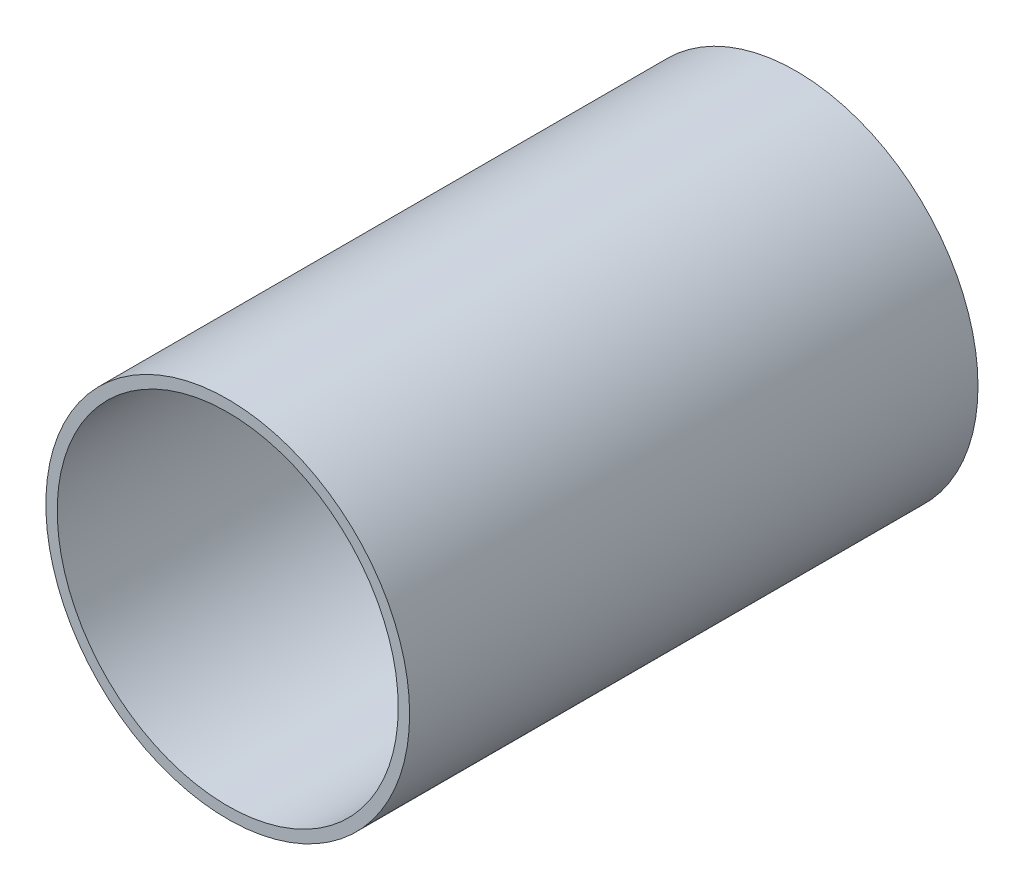
ISO-10303-21;
HEADER;
FILE_DESCRIPTION(('STEP AP214'),'2;1');
FILE_NAME('part.step','',(''),(''),'','','');
FILE_SCHEMA(('AUTOMOTIVE_DESIGN { 1 0 10303 214 1 1 1 1 }'));
ENDSEC;
DATA;
#1=APPLICATION_CONTEXT('core data for automotive mechanical design processes');
#2=APPLICATION_PROTOCOL_DEFINITION('international standard','automotive_design',2000,#1);
#3=PRODUCT_CONTEXT('',#1,'mechanical');
#4=PRODUCT('Part','Part','',(#3));
#5=PRODUCT_RELATED_PRODUCT_CATEGORY('part','',(#4));
#6=PRODUCT_DEFINITION_FORMATION('','',#4);
#7=PRODUCT_DEFINITION_CONTEXT('part definition',#1,'design');
#8=PRODUCT_DEFINITION('design','',#6,#7);
#9=PRODUCT_DEFINITION_SHAPE('','',#8);
#10=(LENGTH_UNIT() NAMED_UNIT(*) SI_UNIT(.MILLI.,.METRE.));
#11=(NAMED_UNIT(*) PLANE_ANGLE_UNIT() SI_UNIT($,.RADIAN.));
#12=(NAMED_UNIT(*) SI_UNIT($,.STERADIAN.) SOLID_ANGLE_UNIT());
#13=UNCERTAINTY_MEASURE_WITH_UNIT(LENGTH_MEASURE(1.E-05),#10,'distance_accuracy_value','');
#14=(GEOMETRIC_REPRESENTATION_CONTEXT(3) GLOBAL_UNCERTAINTY_ASSIGNED_CONTEXT((#13)) GLOBAL_UNIT_ASSIGNED_CONTEXT((#10,
#11,#12)) REPRESENTATION_CONTEXT('',''));
#15=CARTESIAN_POINT('',(0.,0.,0.));
#16=DIRECTION('',(0.,0.,1.));
#17=DIRECTION('',(1.,0.,0.));
#18=AXIS2_PLACEMENT_3D('',#15,#16,#17);
#19=CARTESIAN_POINT('',(0.,0.,100.));
#20=DIRECTION('',(0.,0.,1.));
#21=DIRECTION('',(1.,0.,0.));
#22=AXIS2_PLACEMENT_3D('',#19,#20,#21);
#23=PLANE('',#22);
#24=CARTESIAN_POINT('',(0.,0.,100.));
#25=DIRECTION('',(0.,0.,1.));
#26=DIRECTION('',(1.,0.,0.));
#27=AXIS2_PLACEMENT_3D('',#24,#25,#26);
#28=CIRCLE('',#27,32.);
#29=CARTESIAN_POINT('',(32.,0.,100.));
#30=VERTEX_POINT('',#29);
#31=EDGE_CURVE('E11',#30,#30,#28,.T.);
#32=ORIENTED_EDGE('',*,*,#31,.T.);
#33=EDGE_LOOP('',(#32));
#34=FACE_BOUND('',#33,.T.);
#35=CARTESIAN_POINT('',(0.,0.,100.));
#36=DIRECTION('',(0.,0.,1.));
#37=DIRECTION('',(1.,0.,0.));
#38=AXIS2_PLACEMENT_3D('',#35,#36,#37);
#39=CIRCLE('',#38,30.);
#40=CARTESIAN_POINT('',(30.,0.,100.));
#41=VERTEX_POINT('',#40);
#42=EDGE_CURVE('E50',#41,#41,#39,.T.);
#43=ORIENTED_EDGE('',*,*,#42,.F.);
#44=EDGE_LOOP('',(#43));
#45=FACE_BOUND('',#44,.T.);
#46=ADVANCED_FACE('F39',(#34,#45),#23,.T.);
#47=CARTESIAN_POINT('',(0.,0.,0.));
#48=DIRECTION('',(0.,0.,1.));
#49=DIRECTION('',(1.,0.,0.));
#50=AXIS2_PLACEMENT_3D('',#47,#48,#49);
#51=PLANE('',#50);
#52=CARTESIAN_POINT('',(0.,0.,0.));
#53=DIRECTION('',(0.,0.,1.));
#54=DIRECTION('',(1.,0.,0.));
#55=AXIS2_PLACEMENT_3D('',#52,#53,#54);
#56=CIRCLE('',#55,32.);
#57=CARTESIAN_POINT('',(32.,0.,0.));
#58=VERTEX_POINT('',#57);
#59=EDGE_CURVE('E43',#58,#58,#56,.T.);
#60=ORIENTED_EDGE('',*,*,#59,.F.);
#61=EDGE_LOOP('',(#60));
#62=FACE_BOUND('',#61,.T.);
#63=CARTESIAN_POINT('',(0.,0.,0.));
#64=DIRECTION('',(0.,0.,1.));
#65=DIRECTION('',(1.,0.,0.));
#66=AXIS2_PLACEMENT_3D('',#63,#64,#65);
#67=CIRCLE('',#66,30.);
#68=CARTESIAN_POINT('',(30.,0.,0.));
#69=VERTEX_POINT('',#68);
#70=EDGE_CURVE('E52',#69,#69,#67,.T.);
#71=ORIENTED_EDGE('',*,*,#70,.T.);
#72=EDGE_LOOP('',(#71));
#73=FACE_BOUND('',#72,.T.);
#74=ADVANCED_FACE('F62',(#62,#73),#51,.F.);
#75=CARTESIAN_POINT('',(0.,0.,100.));
#76=DIRECTION('',(0.,0.,-1.));
#77=DIRECTION('',(-1.,0.,0.));
#78=AXIS2_PLACEMENT_3D('',#75,#76,#77);
#79=CYLINDRICAL_SURFACE('',#78,32.);
#80=ORIENTED_EDGE('',*,*,#31,.F.);
#81=EDGE_LOOP('',(#80));
#82=FACE_BOUND('',#81,.T.);
#83=ORIENTED_EDGE('',*,*,#59,.T.);
#84=EDGE_LOOP('',(#83));
#85=FACE_BOUND('',#84,.T.);
#86=ADVANCED_FACE('F41',(#82,#85),#79,.T.);
#87=CARTESIAN_POINT('',(0.,0.,100.));
#88=DIRECTION('',(0.,0.,-1.));
#89=DIRECTION('',(-1.,0.,0.));
#90=AXIS2_PLACEMENT_3D('',#87,#88,#89);
#91=CYLINDRICAL_SURFACE('',#90,30.);
#92=ORIENTED_EDGE('',*,*,#42,.T.);
#93=EDGE_LOOP('',(#92));
#94=FACE_BOUND('',#93,.T.);
#95=ORIENTED_EDGE('',*,*,#70,.F.);
#96=EDGE_LOOP('',(#95));
#97=FACE_BOUND('',#96,.T.);
#98=ADVANCED_FACE('F58',(#94,#97),#91,.F.);
#99=CLOSED_SHELL('',(#46,#74,#86,#98));
#100=MANIFOLD_SOLID_BREP('B2',#99);
#101=ADVANCED_BREP_SHAPE_REPRESENTATION('',(#18,#100),#14);
#102=SHAPE_DEFINITION_REPRESENTATION(#9,#101);
ENDSEC;
END-ISO-10303-21;
